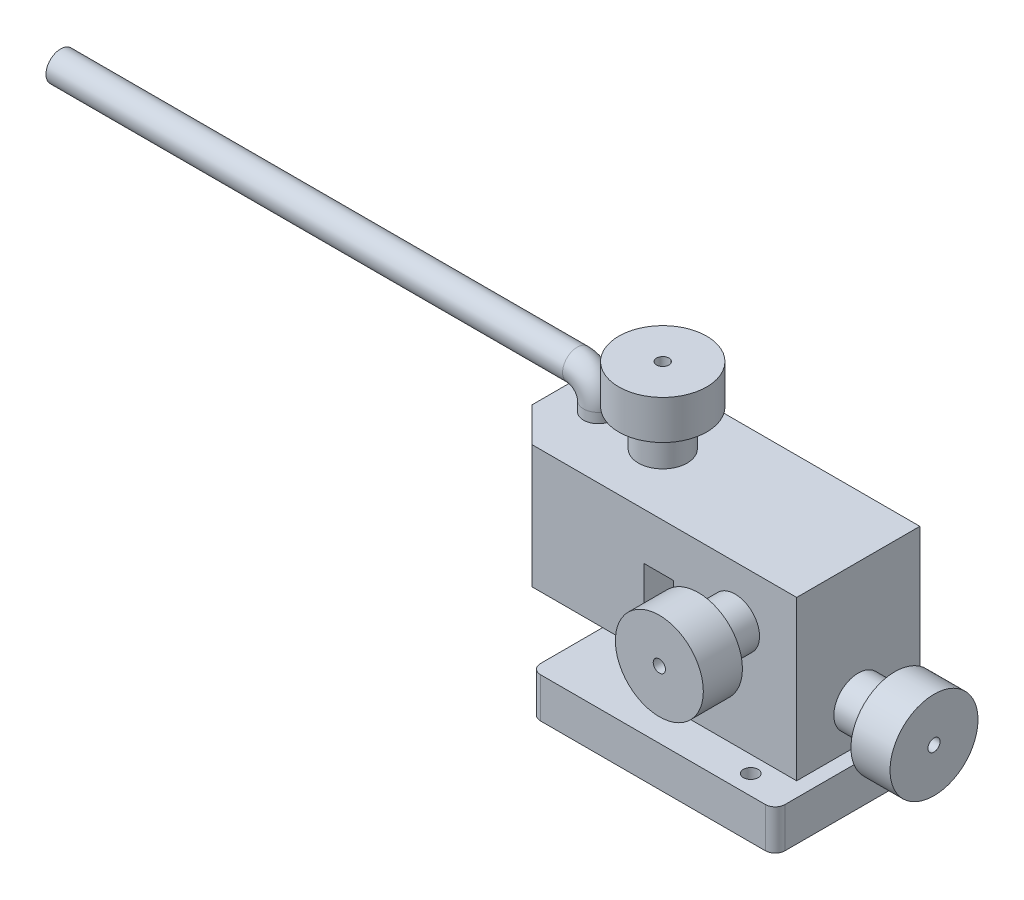
ISO-10303-21;
HEADER;
FILE_DESCRIPTION(('STEP AP214'),'2;1');
FILE_NAME('part.step','',(''),(''),'','','');
FILE_SCHEMA(('AUTOMOTIVE_DESIGN { 1 0 10303 214 1 1 1 1 }'));
ENDSEC;
DATA;
#1=APPLICATION_CONTEXT('core data for automotive mechanical design processes');
#2=APPLICATION_PROTOCOL_DEFINITION('international standard','automotive_design',2000,#1);
#3=PRODUCT_CONTEXT('',#1,'mechanical');
#4=PRODUCT('Part','Part','',(#3));
#5=PRODUCT_RELATED_PRODUCT_CATEGORY('part','',(#4));
#6=PRODUCT_DEFINITION_FORMATION('','',#4);
#7=PRODUCT_DEFINITION_CONTEXT('part definition',#1,'design');
#8=PRODUCT_DEFINITION('design','',#6,#7);
#9=PRODUCT_DEFINITION_SHAPE('','',#8);
#10=(LENGTH_UNIT() NAMED_UNIT(*) SI_UNIT(.MILLI.,.METRE.));
#11=(NAMED_UNIT(*) PLANE_ANGLE_UNIT() SI_UNIT($,.RADIAN.));
#12=(NAMED_UNIT(*) SI_UNIT($,.STERADIAN.) SOLID_ANGLE_UNIT());
#13=UNCERTAINTY_MEASURE_WITH_UNIT(LENGTH_MEASURE(1.E-05),#10,'distance_accuracy_value','');
#14=(GEOMETRIC_REPRESENTATION_CONTEXT(3) GLOBAL_UNCERTAINTY_ASSIGNED_CONTEXT((#13)) GLOBAL_UNIT_ASSIGNED_CONTEXT((#10,
#11,#12)) REPRESENTATION_CONTEXT('',''));
#15=CARTESIAN_POINT('',(0.,0.,0.));
#16=DIRECTION('',(0.,0.,1.));
#17=DIRECTION('',(1.,0.,0.));
#18=AXIS2_PLACEMENT_3D('',#15,#16,#17);
#19=CARTESIAN_POINT('',(21.8,40.7,-32.6));
#20=DIRECTION('',(1.,0.,0.));
#21=DIRECTION('',(0.,0.,-1.));
#22=AXIS2_PLACEMENT_3D('',#19,#20,#21);
#23=PLANE('',#22);
#24=DIRECTION('',(0.,0.,1.));
#25=VECTOR('',#24,1.);
#26=CARTESIAN_POINT('',(21.8,31.1,-32.6));
#27=LINE('',#26,#25);
#28=CARTESIAN_POINT('',(21.8,31.1,-32.6));
#29=VERTEX_POINT('',#28);
#30=CARTESIAN_POINT('',(21.8,31.1,-7.4));
#31=VERTEX_POINT('',#30);
#32=EDGE_CURVE('E189',#29,#31,#27,.T.);
#33=ORIENTED_EDGE('',*,*,#32,.F.);
#34=DIRECTION('',(0.,-1.,0.));
#35=VECTOR('',#34,1.);
#36=CARTESIAN_POINT('',(21.8,40.7,-32.6));
#37=LINE('',#36,#35);
#38=CARTESIAN_POINT('',(21.8,8.2,-32.6));
#39=VERTEX_POINT('',#38);
#40=EDGE_CURVE('E238',#29,#39,#37,.T.);
#41=ORIENTED_EDGE('',*,*,#40,.T.);
#42=DIRECTION('',(0.,0.,1.));
#43=VECTOR('',#42,1.);
#44=CARTESIAN_POINT('',(21.8,8.2,-32.6));
#45=LINE('',#44,#43);
#46=CARTESIAN_POINT('',(21.8,8.2,-7.4));
#47=VERTEX_POINT('',#46);
#48=EDGE_CURVE('E227',#39,#47,#45,.T.);
#49=ORIENTED_EDGE('',*,*,#48,.T.);
#50=DIRECTION('',(0.,-1.,0.));
#51=VECTOR('',#50,1.);
#52=CARTESIAN_POINT('',(21.8,40.7,-7.4));
#53=LINE('',#52,#51);
#54=EDGE_CURVE('E262',#31,#47,#53,.T.);
#55=ORIENTED_EDGE('',*,*,#54,.F.);
#56=EDGE_LOOP('',(#33,#41,#49,#55));
#57=FACE_BOUND('',#56,.T.);
#58=ADVANCED_FACE('F53',(#57),#23,.F.);
#59=CARTESIAN_POINT('',(2.,8.2,-2.));
#60=DIRECTION('',(0.,-1.,0.));
#61=DIRECTION('',(0.,0.,-1.));
#62=AXIS2_PLACEMENT_3D('',#59,#60,#61);
#63=PLANE('',#62);
#64=CARTESIAN_POINT('',(41.,8.2,-4.));
#65=DIRECTION('',(0.,-1.,0.));
#66=DIRECTION('',(0.,0.,-1.));
#67=AXIS2_PLACEMENT_3D('',#64,#65,#66);
#68=CIRCLE('',#67,1.5);
#69=CARTESIAN_POINT('',(41.,8.2,-5.5));
#70=VERTEX_POINT('',#69);
#71=EDGE_CURVE('E469',#70,#70,#68,.F.);
#72=ORIENTED_EDGE('',*,*,#71,.F.);
#73=EDGE_LOOP('',(#72));
#74=FACE_BOUND('',#73,.T.);
#75=CARTESIAN_POINT('',(41.,8.2,-36.));
#76=DIRECTION('',(0.,-1.,0.));
#77=DIRECTION('',(0.,0.,-1.));
#78=AXIS2_PLACEMENT_3D('',#75,#76,#77);
#79=CIRCLE('',#78,1.5);
#80=CARTESIAN_POINT('',(41.,8.2,-37.5));
#81=VERTEX_POINT('',#80);
#82=EDGE_CURVE('E475',#81,#81,#79,.F.);
#83=ORIENTED_EDGE('',*,*,#82,.F.);
#84=EDGE_LOOP('',(#83));
#85=FACE_BOUND('',#84,.T.);
#86=CARTESIAN_POINT('',(2.,8.2,-2.));
#87=DIRECTION('',(0.,1.,0.));
#88=DIRECTION('',(0.,0.,-1.));
#89=AXIS2_PLACEMENT_3D('',#86,#87,#88);
#90=CIRCLE('',#89,2.);
#91=CARTESIAN_POINT('',(0.,8.2,-2.00000000000001));
#92=VERTEX_POINT('',#91);
#93=CARTESIAN_POINT('',(2.00000000000001,8.2,0.));
#94=VERTEX_POINT('',#93);
#95=EDGE_CURVE('E266',#92,#94,#90,.T.);
#96=ORIENTED_EDGE('',*,*,#95,.T.);
#97=DIRECTION('',(1.,0.,0.));
#98=VECTOR('',#97,1.);
#99=CARTESIAN_POINT('',(2.00000000000001,8.2,0.));
#100=LINE('',#99,#98);
#101=CARTESIAN_POINT('',(48.,8.2,0.));
#102=VERTEX_POINT('',#101);
#103=EDGE_CURVE('E270',#94,#102,#100,.T.);
#104=ORIENTED_EDGE('',*,*,#103,.T.);
#105=CARTESIAN_POINT('',(48.,8.2,-2.));
#106=DIRECTION('',(0.,1.,0.));
#107=DIRECTION('',(0.,0.,1.));
#108=AXIS2_PLACEMENT_3D('',#105,#106,#107);
#109=CIRCLE('',#108,2.);
#110=CARTESIAN_POINT('',(50.,8.2,-2.00000000000001));
#111=VERTEX_POINT('',#110);
#112=EDGE_CURVE('E274',#102,#111,#109,.T.);
#113=ORIENTED_EDGE('',*,*,#112,.T.);
#114=DIRECTION('',(0.,0.,-1.));
#115=VECTOR('',#114,1.);
#116=CARTESIAN_POINT('',(50.,8.2,-2.00000000000001));
#117=LINE('',#116,#115);
#118=CARTESIAN_POINT('',(50.,8.2,-38.));
#119=VERTEX_POINT('',#118);
#120=EDGE_CURVE('E277',#111,#119,#117,.T.);
#121=ORIENTED_EDGE('',*,*,#120,.T.);
#122=CARTESIAN_POINT('',(48.,8.2,-38.));
#123=DIRECTION('',(0.,1.,0.));
#124=DIRECTION('',(0.,0.,-1.));
#125=AXIS2_PLACEMENT_3D('',#122,#123,#124);
#126=CIRCLE('',#125,2.);
#127=CARTESIAN_POINT('',(48.,8.2,-40.));
#128=VERTEX_POINT('',#127);
#129=EDGE_CURVE('E280',#119,#128,#126,.T.);
#130=ORIENTED_EDGE('',*,*,#129,.T.);
#131=DIRECTION('',(-1.,0.,0.));
#132=VECTOR('',#131,1.);
#133=CARTESIAN_POINT('',(2.00000000000001,8.2,-40.));
#134=LINE('',#133,#132);
#135=CARTESIAN_POINT('',(2.00000000000001,8.2,-40.));
#136=VERTEX_POINT('',#135);
#137=EDGE_CURVE('E283',#128,#136,#134,.T.);
#138=ORIENTED_EDGE('',*,*,#137,.T.);
#139=CARTESIAN_POINT('',(2.,8.2,-38.));
#140=DIRECTION('',(0.,1.,0.));
#141=DIRECTION('',(0.,0.,-1.));
#142=AXIS2_PLACEMENT_3D('',#139,#140,#141);
#143=CIRCLE('',#142,2.);
#144=CARTESIAN_POINT('',(0.,8.2,-38.));
#145=VERTEX_POINT('',#144);
#146=EDGE_CURVE('E286',#136,#145,#143,.T.);
#147=ORIENTED_EDGE('',*,*,#146,.T.);
#148=DIRECTION('',(0.,0.,1.));
#149=VECTOR('',#148,1.);
#150=CARTESIAN_POINT('',(0.,8.2,-2.00000000000001));
#151=LINE('',#150,#149);
#152=EDGE_CURVE('E289',#145,#92,#151,.T.);
#153=ORIENTED_EDGE('',*,*,#152,.T.);
#154=EDGE_LOOP('',(#96,#104,#113,#121,#130,#138,#147,#153));
#155=FACE_BOUND('',#154,.T.);
#156=ORIENTED_EDGE('',*,*,#48,.F.);
#157=DIRECTION('',(-1.,0.,0.));
#158=VECTOR('',#157,1.);
#159=CARTESIAN_POINT('',(21.8,8.2,-32.6));
#160=LINE('',#159,#158);
#161=CARTESIAN_POINT('',(47.,8.2,-32.6));
#162=VERTEX_POINT('',#161);
#163=EDGE_CURVE('E232',#162,#39,#160,.T.);
#164=ORIENTED_EDGE('',*,*,#163,.F.);
#165=DIRECTION('',(0.,0.,-1.));
#166=VECTOR('',#165,1.);
#167=CARTESIAN_POINT('',(47.,8.2,-32.6));
#168=LINE('',#167,#166);
#169=CARTESIAN_POINT('',(47.,8.2,-7.4));
#170=VERTEX_POINT('',#169);
#171=EDGE_CURVE('E246',#170,#162,#168,.T.);
#172=ORIENTED_EDGE('',*,*,#171,.F.);
#173=DIRECTION('',(1.,0.,0.));
#174=VECTOR('',#173,1.);
#175=CARTESIAN_POINT('',(21.8,8.2,-7.4));
#176=LINE('',#175,#174);
#177=EDGE_CURVE('E242',#47,#170,#176,.T.);
#178=ORIENTED_EDGE('',*,*,#177,.F.);
#179=EDGE_LOOP('',(#156,#164,#172,#178));
#180=FACE_BOUND('',#179,.T.);
#181=ADVANCED_FACE('F389',(#74,#85,#155,#180),#63,.F.);
#182=CARTESIAN_POINT('',(2.,8.2,-2.));
#183=DIRECTION('',(0.,-1.,0.));
#184=DIRECTION('',(0.,0.,-1.));
#185=AXIS2_PLACEMENT_3D('',#182,#183,#184);
#186=CYLINDRICAL_SURFACE('',#185,2.);
#187=CARTESIAN_POINT('',(2.,0.,-2.));
#188=DIRECTION('',(0.,1.,0.));
#189=DIRECTION('',(0.,0.,-1.));
#190=AXIS2_PLACEMENT_3D('',#187,#188,#189);
#191=CIRCLE('',#190,2.);
#192=CARTESIAN_POINT('',(0.,0.,-2.00000000000001));
#193=VERTEX_POINT('',#192);
#194=CARTESIAN_POINT('',(2.00000000000001,0.,0.));
#195=VERTEX_POINT('',#194);
#196=EDGE_CURVE('E265',#193,#195,#191,.T.);
#197=ORIENTED_EDGE('',*,*,#196,.T.);
#198=DIRECTION('',(0.,-1.,0.));
#199=VECTOR('',#198,1.);
#200=CARTESIAN_POINT('',(2.00000000000001,8.2,0.));
#201=LINE('',#200,#199);
#202=EDGE_CURVE('E343',#94,#195,#201,.T.);
#203=ORIENTED_EDGE('',*,*,#202,.F.);
#204=ORIENTED_EDGE('',*,*,#95,.F.);
#205=DIRECTION('',(0.,-1.,0.));
#206=VECTOR('',#205,1.);
#207=CARTESIAN_POINT('',(0.,8.2,-2.00000000000001));
#208=LINE('',#207,#206);
#209=EDGE_CURVE('E292',#92,#193,#208,.T.);
#210=ORIENTED_EDGE('',*,*,#209,.T.);
#211=EDGE_LOOP('',(#197,#203,#204,#210));
#212=FACE_BOUND('',#211,.T.);
#213=ADVANCED_FACE('F539',(#212),#186,.T.);
#214=CARTESIAN_POINT('',(2.00000000000001,8.2,0.));
#215=DIRECTION('',(0.,0.,-1.));
#216=DIRECTION('',(-1.,0.,0.));
#217=AXIS2_PLACEMENT_3D('',#214,#215,#216);
#218=PLANE('',#217);
#219=DIRECTION('',(1.,0.,0.));
#220=VECTOR('',#219,1.);
#221=CARTESIAN_POINT('',(2.00000000000001,0.,0.));
#222=LINE('',#221,#220);
#223=CARTESIAN_POINT('',(48.,0.,0.));
#224=VERTEX_POINT('',#223);
#225=EDGE_CURVE('E296',#195,#224,#222,.T.);
#226=ORIENTED_EDGE('',*,*,#225,.T.);
#227=DIRECTION('',(0.,-1.,0.));
#228=VECTOR('',#227,1.);
#229=CARTESIAN_POINT('',(48.,8.2,0.));
#230=LINE('',#229,#228);
#231=EDGE_CURVE('E339',#102,#224,#230,.T.);
#232=ORIENTED_EDGE('',*,*,#231,.F.);
#233=ORIENTED_EDGE('',*,*,#103,.F.);
#234=ORIENTED_EDGE('',*,*,#202,.T.);
#235=EDGE_LOOP('',(#226,#232,#233,#234));
#236=FACE_BOUND('',#235,.T.);
#237=ADVANCED_FACE('F571',(#236),#218,.F.);
#238=CARTESIAN_POINT('',(48.,8.2,-2.));
#239=DIRECTION('',(0.,-1.,0.));
#240=DIRECTION('',(0.,0.,-1.));
#241=AXIS2_PLACEMENT_3D('',#238,#239,#240);
#242=CYLINDRICAL_SURFACE('',#241,2.);
#243=CARTESIAN_POINT('',(48.,0.,-2.));
#244=DIRECTION('',(0.,1.,0.));
#245=DIRECTION('',(0.,0.,1.));
#246=AXIS2_PLACEMENT_3D('',#243,#244,#245);
#247=CIRCLE('',#246,2.);
#248=CARTESIAN_POINT('',(50.,0.,-2.00000000000001));
#249=VERTEX_POINT('',#248);
#250=EDGE_CURVE('E299',#224,#249,#247,.T.);
#251=ORIENTED_EDGE('',*,*,#250,.T.);
#252=DIRECTION('',(0.,-1.,0.));
#253=VECTOR('',#252,1.);
#254=CARTESIAN_POINT('',(50.,8.2,-2.00000000000001));
#255=LINE('',#254,#253);
#256=EDGE_CURVE('E335',#111,#249,#255,.T.);
#257=ORIENTED_EDGE('',*,*,#256,.F.);
#258=ORIENTED_EDGE('',*,*,#112,.F.);
#259=ORIENTED_EDGE('',*,*,#231,.T.);
#260=EDGE_LOOP('',(#251,#257,#258,#259));
#261=FACE_BOUND('',#260,.T.);
#262=ADVANCED_FACE('F567',(#261),#242,.T.);
#263=CARTESIAN_POINT('',(50.,8.2,-2.00000000000001));
#264=DIRECTION('',(-1.,0.,0.));
#265=DIRECTION('',(0.,0.,1.));
#266=AXIS2_PLACEMENT_3D('',#263,#264,#265);
#267=PLANE('',#266);
#268=DIRECTION('',(0.,0.,-1.));
#269=VECTOR('',#268,1.);
#270=CARTESIAN_POINT('',(50.,0.,-2.00000000000001));
#271=LINE('',#270,#269);
#272=CARTESIAN_POINT('',(50.,0.,-38.));
#273=VERTEX_POINT('',#272);
#274=EDGE_CURVE('E302',#249,#273,#271,.T.);
#275=ORIENTED_EDGE('',*,*,#274,.T.);
#276=DIRECTION('',(0.,-1.,0.));
#277=VECTOR('',#276,1.);
#278=CARTESIAN_POINT('',(50.,8.2,-38.));
#279=LINE('',#278,#277);
#280=EDGE_CURVE('E331',#119,#273,#279,.T.);
#281=ORIENTED_EDGE('',*,*,#280,.F.);
#282=ORIENTED_EDGE('',*,*,#120,.F.);
#283=ORIENTED_EDGE('',*,*,#256,.T.);
#284=EDGE_LOOP('',(#275,#281,#282,#283));
#285=FACE_BOUND('',#284,.T.);
#286=ADVANCED_FACE('F563',(#285),#267,.F.);
#287=CARTESIAN_POINT('',(48.,8.2,-38.));
#288=DIRECTION('',(0.,-1.,0.));
#289=DIRECTION('',(0.,0.,-1.));
#290=AXIS2_PLACEMENT_3D('',#287,#288,#289);
#291=CYLINDRICAL_SURFACE('',#290,2.);
#292=CARTESIAN_POINT('',(48.,0.,-38.));
#293=DIRECTION('',(0.,1.,0.));
#294=DIRECTION('',(0.,0.,-1.));
#295=AXIS2_PLACEMENT_3D('',#292,#293,#294);
#296=CIRCLE('',#295,2.);
#297=CARTESIAN_POINT('',(48.,0.,-40.));
#298=VERTEX_POINT('',#297);
#299=EDGE_CURVE('E305',#273,#298,#296,.T.);
#300=ORIENTED_EDGE('',*,*,#299,.T.);
#301=DIRECTION('',(0.,-1.,0.));
#302=VECTOR('',#301,1.);
#303=CARTESIAN_POINT('',(48.,8.2,-40.));
#304=LINE('',#303,#302);
#305=EDGE_CURVE('E327',#128,#298,#304,.T.);
#306=ORIENTED_EDGE('',*,*,#305,.F.);
#307=ORIENTED_EDGE('',*,*,#129,.F.);
#308=ORIENTED_EDGE('',*,*,#280,.T.);
#309=EDGE_LOOP('',(#300,#306,#307,#308));
#310=FACE_BOUND('',#309,.T.);
#311=ADVANCED_FACE('F559',(#310),#291,.T.);
#312=CARTESIAN_POINT('',(2.00000000000001,8.2,-40.));
#313=DIRECTION('',(0.,0.,1.));
#314=DIRECTION('',(1.,0.,0.));
#315=AXIS2_PLACEMENT_3D('',#312,#313,#314);
#316=PLANE('',#315);
#317=DIRECTION('',(-1.,0.,0.));
#318=VECTOR('',#317,1.);
#319=CARTESIAN_POINT('',(2.00000000000001,0.,-40.));
#320=LINE('',#319,#318);
#321=CARTESIAN_POINT('',(2.00000000000001,0.,-40.));
#322=VERTEX_POINT('',#321);
#323=EDGE_CURVE('E308',#298,#322,#320,.T.);
#324=ORIENTED_EDGE('',*,*,#323,.T.);
#325=DIRECTION('',(0.,-1.,0.));
#326=VECTOR('',#325,1.);
#327=CARTESIAN_POINT('',(2.00000000000001,8.2,-40.));
#328=LINE('',#327,#326);
#329=EDGE_CURVE('E323',#136,#322,#328,.T.);
#330=ORIENTED_EDGE('',*,*,#329,.F.);
#331=ORIENTED_EDGE('',*,*,#137,.F.);
#332=ORIENTED_EDGE('',*,*,#305,.T.);
#333=EDGE_LOOP('',(#324,#330,#331,#332));
#334=FACE_BOUND('',#333,.T.);
#335=ADVANCED_FACE('F555',(#334),#316,.F.);
#336=CARTESIAN_POINT('',(2.,8.2,-38.));
#337=DIRECTION('',(0.,-1.,0.));
#338=DIRECTION('',(0.,0.,-1.));
#339=AXIS2_PLACEMENT_3D('',#336,#337,#338);
#340=CYLINDRICAL_SURFACE('',#339,2.);
#341=CARTESIAN_POINT('',(2.,0.,-38.));
#342=DIRECTION('',(0.,1.,0.));
#343=DIRECTION('',(0.,0.,-1.));
#344=AXIS2_PLACEMENT_3D('',#341,#342,#343);
#345=CIRCLE('',#344,2.);
#346=CARTESIAN_POINT('',(0.,0.,-38.));
#347=VERTEX_POINT('',#346);
#348=EDGE_CURVE('E311',#322,#347,#345,.T.);
#349=ORIENTED_EDGE('',*,*,#348,.T.);
#350=DIRECTION('',(0.,-1.,0.));
#351=VECTOR('',#350,1.);
#352=CARTESIAN_POINT('',(0.,8.2,-38.));
#353=LINE('',#352,#351);
#354=EDGE_CURVE('E319',#145,#347,#353,.T.);
#355=ORIENTED_EDGE('',*,*,#354,.F.);
#356=ORIENTED_EDGE('',*,*,#146,.F.);
#357=ORIENTED_EDGE('',*,*,#329,.T.);
#358=EDGE_LOOP('',(#349,#355,#356,#357));
#359=FACE_BOUND('',#358,.T.);
#360=ADVANCED_FACE('F551',(#359),#340,.T.);
#361=CARTESIAN_POINT('',(0.,8.2,-2.00000000000001));
#362=DIRECTION('',(1.,0.,0.));
#363=DIRECTION('',(0.,0.,-1.));
#364=AXIS2_PLACEMENT_3D('',#361,#362,#363);
#365=PLANE('',#364);
#366=DIRECTION('',(0.,0.,1.));
#367=VECTOR('',#366,1.);
#368=CARTESIAN_POINT('',(0.,0.,-2.00000000000001));
#369=LINE('',#368,#367);
#370=EDGE_CURVE('E271',#347,#193,#369,.T.);
#371=ORIENTED_EDGE('',*,*,#370,.T.);
#372=ORIENTED_EDGE('',*,*,#209,.F.);
#373=ORIENTED_EDGE('',*,*,#152,.F.);
#374=ORIENTED_EDGE('',*,*,#354,.T.);
#375=EDGE_LOOP('',(#371,#372,#373,#374));
#376=FACE_BOUND('',#375,.T.);
#377=ADVANCED_FACE('F547',(#376),#365,.F.);
#378=CARTESIAN_POINT('',(2.,0.,-2.));
#379=DIRECTION('',(0.,-1.,0.));
#380=DIRECTION('',(0.,0.,-1.));
#381=AXIS2_PLACEMENT_3D('',#378,#379,#380);
#382=PLANE('',#381);
#383=CARTESIAN_POINT('',(41.,0.,-4.));
#384=DIRECTION('',(0.,-1.,0.));
#385=DIRECTION('',(0.,0.,-1.));
#386=AXIS2_PLACEMENT_3D('',#383,#384,#385);
#387=CIRCLE('',#386,1.5);
#388=CARTESIAN_POINT('',(41.,0.,-5.5));
#389=VERTEX_POINT('',#388);
#390=EDGE_CURVE('E474',#389,#389,#387,.T.);
#391=ORIENTED_EDGE('',*,*,#390,.F.);
#392=EDGE_LOOP('',(#391));
#393=FACE_BOUND('',#392,.T.);
#394=CARTESIAN_POINT('',(41.,0.,-36.));
#395=DIRECTION('',(0.,-1.,0.));
#396=DIRECTION('',(0.,0.,-1.));
#397=AXIS2_PLACEMENT_3D('',#394,#395,#396);
#398=CIRCLE('',#397,1.5);
#399=CARTESIAN_POINT('',(41.,0.,-37.5));
#400=VERTEX_POINT('',#399);
#401=EDGE_CURVE('E470',#400,#400,#398,.T.);
#402=ORIENTED_EDGE('',*,*,#401,.F.);
#403=EDGE_LOOP('',(#402));
#404=FACE_BOUND('',#403,.T.);
#405=ORIENTED_EDGE('',*,*,#196,.F.);
#406=ORIENTED_EDGE('',*,*,#370,.F.);
#407=ORIENTED_EDGE('',*,*,#348,.F.);
#408=ORIENTED_EDGE('',*,*,#323,.F.);
#409=ORIENTED_EDGE('',*,*,#299,.F.);
#410=ORIENTED_EDGE('',*,*,#274,.F.);
#411=ORIENTED_EDGE('',*,*,#250,.F.);
#412=ORIENTED_EDGE('',*,*,#225,.F.);
#413=EDGE_LOOP('',(#405,#406,#407,#408,#409,#410,#411,#412));
#414=FACE_BOUND('',#413,.T.);
#415=ADVANCED_FACE('F544',(#393,#404,#414),#382,.T.);
#416=CARTESIAN_POINT('',(21.8,40.7,-7.4));
#417=DIRECTION('',(0.,0.,-1.));
#418=DIRECTION('',(-1.,0.,0.));
#419=AXIS2_PLACEMENT_3D('',#416,#417,#418);
#420=PLANE('',#419);
#421=CARTESIAN_POINT('',(34.4,30.,-7.4));
#422=DIRECTION('',(0.,0.,-1.));
#423=DIRECTION('',(-1.,0.,0.));
#424=AXIS2_PLACEMENT_3D('',#421,#422,#423);
#425=CIRCLE('',#424,5.);
#426=CARTESIAN_POINT('',(29.4,30.,-7.4));
#427=VERTEX_POINT('',#426);
#428=EDGE_CURVE('E11',#427,#427,#425,.F.);
#429=ORIENTED_EDGE('',*,*,#428,.F.);
#430=EDGE_LOOP('',(#429));
#431=FACE_BOUND('',#430,.T.);
#432=DIRECTION('',(1.,0.,0.));
#433=VECTOR('',#432,1.);
#434=CARTESIAN_POINT('',(21.8,40.7,-7.4));
#435=LINE('',#434,#433);
#436=CARTESIAN_POINT('',(-7.19999999999998,40.7,-7.4));
#437=VERTEX_POINT('',#436);
#438=CARTESIAN_POINT('',(47.,40.7,-7.4));
#439=VERTEX_POINT('',#438);
#440=EDGE_CURVE('E228',#437,#439,#435,.T.);
#441=ORIENTED_EDGE('',*,*,#440,.F.);
#442=DIRECTION('',(0.,-1.,0.));
#443=VECTOR('',#442,1.);
#444=CARTESIAN_POINT('',(-7.19999999999998,15.5,-7.4));
#445=LINE('',#444,#443);
#446=CARTESIAN_POINT('',(-7.19999999999998,15.5,-7.4));
#447=VERTEX_POINT('',#446);
#448=EDGE_CURVE('E78',#437,#447,#445,.T.);
#449=ORIENTED_EDGE('',*,*,#448,.T.);
#450=DIRECTION('',(1.,0.,0.));
#451=VECTOR('',#450,1.);
#452=CARTESIAN_POINT('',(-14.2,15.5,-7.4));
#453=LINE('',#452,#451);
#454=CARTESIAN_POINT('',(15.8,15.5,-7.4));
#455=VERTEX_POINT('',#454);
#456=EDGE_CURVE('E190',#447,#455,#453,.T.);
#457=ORIENTED_EDGE('',*,*,#456,.T.);
#458=DIRECTION('',(0.,1.,0.));
#459=VECTOR('',#458,1.);
#460=CARTESIAN_POINT('',(15.8,40.7,-7.4));
#461=LINE('',#460,#459);
#462=CARTESIAN_POINT('',(15.8,31.1,-7.4));
#463=VERTEX_POINT('',#462);
#464=EDGE_CURVE('E205',#455,#463,#461,.T.);
#465=ORIENTED_EDGE('',*,*,#464,.T.);
#466=DIRECTION('',(1.,0.,0.));
#467=VECTOR('',#466,1.);
#468=CARTESIAN_POINT('',(15.8,31.1,-7.4));
#469=LINE('',#468,#467);
#470=EDGE_CURVE('E219',#463,#31,#469,.T.);
#471=ORIENTED_EDGE('',*,*,#470,.T.);
#472=ORIENTED_EDGE('',*,*,#54,.T.);
#473=ORIENTED_EDGE('',*,*,#177,.T.);
#474=DIRECTION('',(0.,-1.,0.));
#475=VECTOR('',#474,1.);
#476=CARTESIAN_POINT('',(47.,40.7,-7.4));
#477=LINE('',#476,#475);
#478=EDGE_CURVE('E258',#439,#170,#477,.T.);
#479=ORIENTED_EDGE('',*,*,#478,.F.);
#480=EDGE_LOOP('',(#441,#449,#457,#465,#471,#472,#473,#479));
#481=FACE_BOUND('',#480,.T.);
#482=ADVANCED_FACE('F379',(#431,#481),#420,.F.);
#483=CARTESIAN_POINT('',(47.,40.7,-32.6));
#484=DIRECTION('',(-1.,0.,0.));
#485=DIRECTION('',(0.,0.,1.));
#486=AXIS2_PLACEMENT_3D('',#483,#484,#485);
#487=PLANE('',#486);
#488=CARTESIAN_POINT('',(47.,16.,-20.));
#489=DIRECTION('',(-1.,0.,0.));
#490=DIRECTION('',(0.,0.,1.));
#491=AXIS2_PLACEMENT_3D('',#488,#489,#490);
#492=CIRCLE('',#491,5.);
#493=CARTESIAN_POINT('',(47.,16.,-15.));
#494=VERTEX_POINT('',#493);
#495=EDGE_CURVE('E63',#494,#494,#492,.F.);
#496=ORIENTED_EDGE('',*,*,#495,.F.);
#497=EDGE_LOOP('',(#496));
#498=FACE_BOUND('',#497,.T.);
#499=ORIENTED_EDGE('',*,*,#171,.T.);
#500=DIRECTION('',(0.,-1.,0.));
#501=VECTOR('',#500,1.);
#502=CARTESIAN_POINT('',(47.,40.7,-32.6));
#503=LINE('',#502,#501);
#504=CARTESIAN_POINT('',(47.,40.7,-32.6));
#505=VERTEX_POINT('',#504);
#506=EDGE_CURVE('E255',#505,#162,#503,.T.);
#507=ORIENTED_EDGE('',*,*,#506,.F.);
#508=DIRECTION('',(0.,0.,-1.));
#509=VECTOR('',#508,1.);
#510=CARTESIAN_POINT('',(47.,40.7,-32.6));
#511=LINE('',#510,#509);
#512=EDGE_CURVE('E231',#439,#505,#511,.T.);
#513=ORIENTED_EDGE('',*,*,#512,.F.);
#514=ORIENTED_EDGE('',*,*,#478,.T.);
#515=EDGE_LOOP('',(#499,#507,#513,#514));
#516=FACE_BOUND('',#515,.T.);
#517=ADVANCED_FACE('F376',(#498,#516),#487,.F.);
#518=CARTESIAN_POINT('',(21.8,40.7,-32.6));
#519=DIRECTION('',(0.,0.,1.));
#520=DIRECTION('',(1.,0.,0.));
#521=AXIS2_PLACEMENT_3D('',#518,#519,#520);
#522=PLANE('',#521);
#523=ORIENTED_EDGE('',*,*,#506,.T.);
#524=ORIENTED_EDGE('',*,*,#163,.T.);
#525=ORIENTED_EDGE('',*,*,#40,.F.);
#526=DIRECTION('',(1.,0.,0.));
#527=VECTOR('',#526,1.);
#528=CARTESIAN_POINT('',(15.8,31.1,-32.6));
#529=LINE('',#528,#527);
#530=CARTESIAN_POINT('',(15.8,31.1,-32.6));
#531=VERTEX_POINT('',#530);
#532=EDGE_CURVE('E197',#531,#29,#529,.T.);
#533=ORIENTED_EDGE('',*,*,#532,.F.);
#534=DIRECTION('',(0.,-1.,0.));
#535=VECTOR('',#534,1.);
#536=CARTESIAN_POINT('',(15.8,40.7,-32.6));
#537=LINE('',#536,#535);
#538=CARTESIAN_POINT('',(15.8,15.5,-32.6));
#539=VERTEX_POINT('',#538);
#540=EDGE_CURVE('E194',#531,#539,#537,.T.);
#541=ORIENTED_EDGE('',*,*,#540,.T.);
#542=DIRECTION('',(1.,0.,0.));
#543=VECTOR('',#542,1.);
#544=CARTESIAN_POINT('',(-14.2,15.5,-32.6));
#545=LINE('',#544,#543);
#546=CARTESIAN_POINT('',(-7.19999999999998,15.5,-32.6));
#547=VERTEX_POINT('',#546);
#548=EDGE_CURVE('E179',#547,#539,#545,.T.);
#549=ORIENTED_EDGE('',*,*,#548,.F.);
#550=DIRECTION('',(0.,1.,0.));
#551=VECTOR('',#550,1.);
#552=CARTESIAN_POINT('',(-7.19999999999998,40.7,-32.6));
#553=LINE('',#552,#551);
#554=CARTESIAN_POINT('',(-7.19999999999998,40.7,-32.6));
#555=VERTEX_POINT('',#554);
#556=EDGE_CURVE('E368',#547,#555,#553,.T.);
#557=ORIENTED_EDGE('',*,*,#556,.T.);
#558=DIRECTION('',(-1.,0.,0.));
#559=VECTOR('',#558,1.);
#560=CARTESIAN_POINT('',(21.8,40.7,-32.6));
#561=LINE('',#560,#559);
#562=EDGE_CURVE('E235',#505,#555,#561,.T.);
#563=ORIENTED_EDGE('',*,*,#562,.F.);
#564=EDGE_LOOP('',(#523,#524,#525,#533,#541,#549,#557,#563));
#565=FACE_BOUND('',#564,.T.);
#566=ADVANCED_FACE('F195',(#565),#522,.F.);
#567=CARTESIAN_POINT('',(0.,40.7,0.));
#568=DIRECTION('',(0.,1.,0.));
#569=DIRECTION('',(0.,0.,1.));
#570=AXIS2_PLACEMENT_3D('',#567,#568,#569);
#571=PLANE('',#570);
#572=CARTESIAN_POINT('',(-6.2,40.7,-20.));
#573=DIRECTION('',(0.,-1.,0.));
#574=DIRECTION('',(0.,0.,-1.));
#575=AXIS2_PLACEMENT_3D('',#572,#573,#574);
#576=CIRCLE('',#575,3.);
#577=CARTESIAN_POINT('',(-6.2,40.7,-23.));
#578=VERTEX_POINT('',#577);
#579=EDGE_CURVE('E465',#578,#578,#576,.T.);
#580=ORIENTED_EDGE('',*,*,#579,.T.);
#581=EDGE_LOOP('',(#580));
#582=FACE_BOUND('',#581,.T.);
#583=CARTESIAN_POINT('',(6.99999999999999,40.7,-20.));
#584=DIRECTION('',(0.,1.,0.));
#585=DIRECTION('',(0.,0.,1.));
#586=AXIS2_PLACEMENT_3D('',#583,#584,#585);
#587=CIRCLE('',#586,5.);
#588=CARTESIAN_POINT('',(6.99999999999999,40.7,-15.));
#589=VERTEX_POINT('',#588);
#590=EDGE_CURVE('E430',#589,#589,#587,.T.);
#591=ORIENTED_EDGE('',*,*,#590,.F.);
#592=EDGE_LOOP('',(#591));
#593=FACE_BOUND('',#592,.T.);
#594=DIRECTION('',(0.,0.,-1.));
#595=VECTOR('',#594,1.);
#596=CARTESIAN_POINT('',(-14.2,40.7,-32.6));
#597=LINE('',#596,#595);
#598=CARTESIAN_POINT('',(-14.2,40.7,-14.4));
#599=VERTEX_POINT('',#598);
#600=CARTESIAN_POINT('',(-14.2,40.7,-25.6));
#601=VERTEX_POINT('',#600);
#602=EDGE_CURVE('E214',#599,#601,#597,.T.);
#603=ORIENTED_EDGE('',*,*,#602,.F.);
#604=DIRECTION('',(0.707106781186549,0.,0.707106781186546));
#605=VECTOR('',#604,1.);
#606=CARTESIAN_POINT('',(0.100000000000021,40.7,-0.100000000000021));
#607=LINE('',#606,#605);
#608=EDGE_CURVE('E358',#599,#437,#607,.T.);
#609=ORIENTED_EDGE('',*,*,#608,.T.);
#610=ORIENTED_EDGE('',*,*,#440,.T.);
#611=ORIENTED_EDGE('',*,*,#512,.T.);
#612=ORIENTED_EDGE('',*,*,#562,.T.);
#613=DIRECTION('',(-0.707106781186549,0.,0.707106781186546));
#614=VECTOR('',#613,1.);
#615=CARTESIAN_POINT('',(-19.9,40.7,-19.9));
#616=LINE('',#615,#614);
#617=EDGE_CURVE('E355',#555,#601,#616,.T.);
#618=ORIENTED_EDGE('',*,*,#617,.T.);
#619=EDGE_LOOP('',(#603,#609,#610,#611,#612,#618));
#620=FACE_BOUND('',#619,.T.);
#621=ADVANCED_FACE('F396',(#582,#593,#620),#571,.T.);
#622=CARTESIAN_POINT('',(15.8,31.1,-32.6));
#623=DIRECTION('',(0.,1.,0.));
#624=DIRECTION('',(0.,0.,1.));
#625=AXIS2_PLACEMENT_3D('',#622,#623,#624);
#626=PLANE('',#625);
#627=ORIENTED_EDGE('',*,*,#32,.T.);
#628=ORIENTED_EDGE('',*,*,#470,.F.);
#629=DIRECTION('',(0.,0.,1.));
#630=VECTOR('',#629,1.);
#631=CARTESIAN_POINT('',(15.8,31.1,-32.6));
#632=LINE('',#631,#630);
#633=EDGE_CURVE('E216',#531,#463,#632,.T.);
#634=ORIENTED_EDGE('',*,*,#633,.F.);
#635=ORIENTED_EDGE('',*,*,#532,.T.);
#636=EDGE_LOOP('',(#627,#628,#634,#635));
#637=FACE_BOUND('',#636,.T.);
#638=ADVANCED_FACE('F596',(#637),#626,.F.);
#639=CARTESIAN_POINT('',(15.8,0.,0.));
#640=DIRECTION('',(-1.,0.,0.));
#641=DIRECTION('',(0.,0.,1.));
#642=AXIS2_PLACEMENT_3D('',#639,#640,#641);
#643=PLANE('',#642);
#644=ORIENTED_EDGE('',*,*,#540,.F.);
#645=ORIENTED_EDGE('',*,*,#633,.T.);
#646=ORIENTED_EDGE('',*,*,#464,.F.);
#647=DIRECTION('',(0.,0.,1.));
#648=VECTOR('',#647,1.);
#649=CARTESIAN_POINT('',(15.8,15.5,-32.6));
#650=LINE('',#649,#648);
#651=EDGE_CURVE('E183',#539,#455,#650,.T.);
#652=ORIENTED_EDGE('',*,*,#651,.F.);
#653=EDGE_LOOP('',(#644,#645,#646,#652));
#654=FACE_BOUND('',#653,.T.);
#655=ADVANCED_FACE('F203',(#654),#643,.F.);
#656=CARTESIAN_POINT('',(-14.2,15.5,-32.6));
#657=DIRECTION('',(0.,1.,0.));
#658=DIRECTION('',(0.,0.,1.));
#659=AXIS2_PLACEMENT_3D('',#656,#657,#658);
#660=PLANE('',#659);
#661=ORIENTED_EDGE('',*,*,#456,.F.);
#662=DIRECTION('',(-0.707106781186549,0.,-0.707106781186546));
#663=VECTOR('',#662,1.);
#664=CARTESIAN_POINT('',(-14.2,15.5,-14.4));
#665=LINE('',#664,#663);
#666=CARTESIAN_POINT('',(-14.2,15.5,-14.4));
#667=VERTEX_POINT('',#666);
#668=EDGE_CURVE('E365',#447,#667,#665,.T.);
#669=ORIENTED_EDGE('',*,*,#668,.T.);
#670=DIRECTION('',(0.,0.,1.));
#671=VECTOR('',#670,1.);
#672=CARTESIAN_POINT('',(-14.2,15.5,-32.6));
#673=LINE('',#672,#671);
#674=CARTESIAN_POINT('',(-14.2,15.5,-25.6));
#675=VERTEX_POINT('',#674);
#676=EDGE_CURVE('E209',#675,#667,#673,.T.);
#677=ORIENTED_EDGE('',*,*,#676,.F.);
#678=DIRECTION('',(0.707106781186549,0.,-0.707106781186546));
#679=VECTOR('',#678,1.);
#680=CARTESIAN_POINT('',(-14.2,15.5,-25.6));
#681=LINE('',#680,#679);
#682=EDGE_CURVE('E70',#675,#547,#681,.T.);
#683=ORIENTED_EDGE('',*,*,#682,.T.);
#684=ORIENTED_EDGE('',*,*,#548,.T.);
#685=ORIENTED_EDGE('',*,*,#651,.T.);
#686=EDGE_LOOP('',(#661,#669,#677,#683,#684,#685));
#687=FACE_BOUND('',#686,.T.);
#688=ADVANCED_FACE('F181',(#687),#660,.F.);
#689=CARTESIAN_POINT('',(-14.2,0.,0.));
#690=DIRECTION('',(-1.,0.,0.));
#691=DIRECTION('',(0.,0.,1.));
#692=AXIS2_PLACEMENT_3D('',#689,#690,#691);
#693=PLANE('',#692);
#694=ORIENTED_EDGE('',*,*,#676,.T.);
#695=DIRECTION('',(0.,1.,0.));
#696=VECTOR('',#695,1.);
#697=CARTESIAN_POINT('',(-14.2,40.7,-14.4));
#698=LINE('',#697,#696);
#699=EDGE_CURVE('E351',#667,#599,#698,.T.);
#700=ORIENTED_EDGE('',*,*,#699,.T.);
#701=ORIENTED_EDGE('',*,*,#602,.T.);
#702=DIRECTION('',(0.,-1.,0.));
#703=VECTOR('',#702,1.);
#704=CARTESIAN_POINT('',(-14.2,15.5,-25.6));
#705=LINE('',#704,#703);
#706=EDGE_CURVE('E347',#601,#675,#705,.T.);
#707=ORIENTED_EDGE('',*,*,#706,.T.);
#708=EDGE_LOOP('',(#694,#700,#701,#707));
#709=FACE_BOUND('',#708,.T.);
#710=ADVANCED_FACE('F404',(#709),#693,.T.);
#711=CARTESIAN_POINT('',(-14.2,0.,-14.4));
#712=DIRECTION('',(-0.707106781186546,0.,0.707106781186549));
#713=DIRECTION('',(0.,-1.,0.));
#714=AXIS2_PLACEMENT_3D('',#711,#712,#713);
#715=PLANE('',#714);
#716=ORIENTED_EDGE('',*,*,#668,.F.);
#717=ORIENTED_EDGE('',*,*,#448,.F.);
#718=ORIENTED_EDGE('',*,*,#608,.F.);
#719=ORIENTED_EDGE('',*,*,#699,.F.);
#720=EDGE_LOOP('',(#716,#717,#718,#719));
#721=FACE_BOUND('',#720,.T.);
#722=ADVANCED_FACE('F400',(#721),#715,.T.);
#723=CARTESIAN_POINT('',(-14.2,0.,-25.6));
#724=DIRECTION('',(-0.707106781186546,0.,-0.707106781186549));
#725=DIRECTION('',(0.,1.,0.));
#726=AXIS2_PLACEMENT_3D('',#723,#724,#725);
#727=PLANE('',#726);
#728=ORIENTED_EDGE('',*,*,#617,.F.);
#729=ORIENTED_EDGE('',*,*,#556,.F.);
#730=ORIENTED_EDGE('',*,*,#682,.F.);
#731=ORIENTED_EDGE('',*,*,#706,.F.);
#732=EDGE_LOOP('',(#728,#729,#730,#731));
#733=FACE_BOUND('',#732,.T.);
#734=ADVANCED_FACE('F56',(#733),#727,.T.);
#735=CARTESIAN_POINT('',(54.5,16.,-20.));
#736=DIRECTION('',(-1.,0.,0.));
#737=DIRECTION('',(0.,0.,1.));
#738=AXIS2_PLACEMENT_3D('',#735,#736,#737);
#739=CYLINDRICAL_SURFACE('',#738,5.);
#740=CARTESIAN_POINT('',(54.5,16.,-20.));
#741=DIRECTION('',(1.,0.,0.));
#742=DIRECTION('',(0.,0.,-1.));
#743=AXIS2_PLACEMENT_3D('',#740,#741,#742);
#744=CIRCLE('',#743,5.);
#745=CARTESIAN_POINT('',(54.5,16.,-25.));
#746=VERTEX_POINT('',#745);
#747=EDGE_CURVE('E201',#746,#746,#744,.T.);
#748=ORIENTED_EDGE('',*,*,#747,.F.);
#749=EDGE_LOOP('',(#748));
#750=FACE_BOUND('',#749,.T.);
#751=ORIENTED_EDGE('',*,*,#495,.T.);
#752=EDGE_LOOP('',(#751));
#753=FACE_BOUND('',#752,.T.);
#754=ADVANCED_FACE('F374',(#750,#753),#739,.T.);
#755=CARTESIAN_POINT('',(62.5,16.,-20.));
#756=DIRECTION('',(-1.,0.,0.));
#757=DIRECTION('',(0.,0.,1.));
#758=AXIS2_PLACEMENT_3D('',#755,#756,#757);
#759=CYLINDRICAL_SURFACE('',#758,9.);
#760=CARTESIAN_POINT('',(62.5,16.,-20.));
#761=DIRECTION('',(1.,0.,0.));
#762=DIRECTION('',(0.,0.,-1.));
#763=AXIS2_PLACEMENT_3D('',#760,#761,#762);
#764=CIRCLE('',#763,9.);
#765=CARTESIAN_POINT('',(62.5,16.,-29.));
#766=VERTEX_POINT('',#765);
#767=EDGE_CURVE('E413',#766,#766,#764,.T.);
#768=ORIENTED_EDGE('',*,*,#767,.F.);
#769=EDGE_LOOP('',(#768));
#770=FACE_BOUND('',#769,.T.);
#771=CARTESIAN_POINT('',(54.5,16.,-20.));
#772=DIRECTION('',(1.,0.,0.));
#773=DIRECTION('',(0.,0.,-1.));
#774=AXIS2_PLACEMENT_3D('',#771,#772,#773);
#775=CIRCLE('',#774,9.);
#776=CARTESIAN_POINT('',(54.5,16.,-29.));
#777=VERTEX_POINT('',#776);
#778=EDGE_CURVE('E414',#777,#777,#775,.T.);
#779=ORIENTED_EDGE('',*,*,#778,.T.);
#780=EDGE_LOOP('',(#779));
#781=FACE_BOUND('',#780,.T.);
#782=ADVANCED_FACE('F906',(#770,#781),#759,.T.);
#783=CARTESIAN_POINT('',(62.5,16.,-20.));
#784=DIRECTION('',(1.,0.,0.));
#785=DIRECTION('',(0.,0.,-1.));
#786=AXIS2_PLACEMENT_3D('',#783,#784,#785);
#787=PLANE('',#786);
#788=CARTESIAN_POINT('',(62.5,16.,-20.));
#789=DIRECTION('',(1.,0.,0.));
#790=DIRECTION('',(0.,0.,-1.));
#791=AXIS2_PLACEMENT_3D('',#788,#789,#790);
#792=CIRCLE('',#791,1.25);
#793=CARTESIAN_POINT('',(62.5,16.,-21.25));
#794=VERTEX_POINT('',#793);
#795=EDGE_CURVE('E422',#794,#794,#792,.T.);
#796=ORIENTED_EDGE('',*,*,#795,.F.);
#797=EDGE_LOOP('',(#796));
#798=FACE_BOUND('',#797,.T.);
#799=ORIENTED_EDGE('',*,*,#767,.T.);
#800=EDGE_LOOP('',(#799));
#801=FACE_BOUND('',#800,.T.);
#802=ADVANCED_FACE('F896',(#798,#801),#787,.T.);
#803=CARTESIAN_POINT('',(54.5,16.,-20.));
#804=DIRECTION('',(1.,0.,0.));
#805=DIRECTION('',(0.,0.,-1.));
#806=AXIS2_PLACEMENT_3D('',#803,#804,#805);
#807=PLANE('',#806);
#808=ORIENTED_EDGE('',*,*,#747,.T.);
#809=EDGE_LOOP('',(#808));
#810=FACE_BOUND('',#809,.T.);
#811=ORIENTED_EDGE('',*,*,#778,.F.);
#812=EDGE_LOOP('',(#811));
#813=FACE_BOUND('',#812,.T.);
#814=ADVANCED_FACE('F885',(#810,#813),#807,.F.);
#815=CARTESIAN_POINT('',(58.5,16.,-20.));
#816=DIRECTION('',(1.,0.,0.));
#817=DIRECTION('',(0.,0.,-1.));
#818=AXIS2_PLACEMENT_3D('',#815,#816,#817);
#819=CYLINDRICAL_SURFACE('',#818,1.25);
#820=CARTESIAN_POINT('',(58.5,16.,-20.));
#821=DIRECTION('',(1.,0.,0.));
#822=DIRECTION('',(0.,0.,-1.));
#823=AXIS2_PLACEMENT_3D('',#820,#821,#822);
#824=CIRCLE('',#823,1.25);
#825=CARTESIAN_POINT('',(58.5,16.,-21.25));
#826=VERTEX_POINT('',#825);
#827=EDGE_CURVE('E418',#826,#826,#824,.T.);
#828=ORIENTED_EDGE('',*,*,#827,.F.);
#829=EDGE_LOOP('',(#828));
#830=FACE_BOUND('',#829,.T.);
#831=ORIENTED_EDGE('',*,*,#795,.T.);
#832=EDGE_LOOP('',(#831));
#833=FACE_BOUND('',#832,.T.);
#834=ADVANCED_FACE('F875',(#830,#833),#819,.F.);
#835=CARTESIAN_POINT('',(58.5,16.,-20.));
#836=DIRECTION('',(1.,0.,0.));
#837=DIRECTION('',(0.,0.,-1.));
#838=AXIS2_PLACEMENT_3D('',#835,#836,#837);
#839=PLANE('',#838);
#840=ORIENTED_EDGE('',*,*,#827,.T.);
#841=EDGE_LOOP('',(#840));
#842=FACE_BOUND('',#841,.T.);
#843=ADVANCED_FACE('F865',(#842),#839,.T.);
#844=CARTESIAN_POINT('',(6.99999999999999,48.2,-20.));
#845=DIRECTION('',(0.,-1.,0.));
#846=DIRECTION('',(0.,0.,-1.));
#847=AXIS2_PLACEMENT_3D('',#844,#845,#846);
#848=CYLINDRICAL_SURFACE('',#847,5.);
#849=CARTESIAN_POINT('',(6.99999999999999,48.2,-20.));
#850=DIRECTION('',(0.,1.,0.));
#851=DIRECTION('',(0.,0.,1.));
#852=AXIS2_PLACEMENT_3D('',#849,#850,#851);
#853=CIRCLE('',#852,5.);
#854=CARTESIAN_POINT('',(6.99999999999999,48.2,-15.));
#855=VERTEX_POINT('',#854);
#856=EDGE_CURVE('E426',#855,#855,#853,.T.);
#857=ORIENTED_EDGE('',*,*,#856,.F.);
#858=EDGE_LOOP('',(#857));
#859=FACE_BOUND('',#858,.T.);
#860=ORIENTED_EDGE('',*,*,#590,.T.);
#861=EDGE_LOOP('',(#860));
#862=FACE_BOUND('',#861,.T.);
#863=ADVANCED_FACE('F855',(#859,#862),#848,.T.);
#864=CARTESIAN_POINT('',(6.99999999999999,56.2,-20.));
#865=DIRECTION('',(0.,-1.,0.));
#866=DIRECTION('',(0.,0.,-1.));
#867=AXIS2_PLACEMENT_3D('',#864,#865,#866);
#868=CYLINDRICAL_SURFACE('',#867,9.);
#869=CARTESIAN_POINT('',(6.99999999999999,56.2,-20.));
#870=DIRECTION('',(0.,1.,0.));
#871=DIRECTION('',(0.,0.,1.));
#872=AXIS2_PLACEMENT_3D('',#869,#870,#871);
#873=CIRCLE('',#872,9.);
#874=CARTESIAN_POINT('',(6.99999999999999,56.2,-11.));
#875=VERTEX_POINT('',#874);
#876=EDGE_CURVE('E434',#875,#875,#873,.T.);
#877=ORIENTED_EDGE('',*,*,#876,.F.);
#878=EDGE_LOOP('',(#877));
#879=FACE_BOUND('',#878,.T.);
#880=CARTESIAN_POINT('',(6.99999999999999,48.2,-20.));
#881=DIRECTION('',(0.,1.,0.));
#882=DIRECTION('',(0.,0.,1.));
#883=AXIS2_PLACEMENT_3D('',#880,#881,#882);
#884=CIRCLE('',#883,9.);
#885=CARTESIAN_POINT('',(6.99999999999999,48.2,-11.));
#886=VERTEX_POINT('',#885);
#887=EDGE_CURVE('E438',#886,#886,#884,.T.);
#888=ORIENTED_EDGE('',*,*,#887,.T.);
#889=EDGE_LOOP('',(#888));
#890=FACE_BOUND('',#889,.T.);
#891=ADVANCED_FACE('F846',(#879,#890),#868,.T.);
#892=CARTESIAN_POINT('',(6.99999999999999,56.2,-20.));
#893=DIRECTION('',(0.,1.,0.));
#894=DIRECTION('',(0.,0.,1.));
#895=AXIS2_PLACEMENT_3D('',#892,#893,#894);
#896=PLANE('',#895);
#897=CARTESIAN_POINT('',(6.99999999999999,56.2,-20.));
#898=DIRECTION('',(0.,1.,0.));
#899=DIRECTION('',(0.,0.,1.));
#900=AXIS2_PLACEMENT_3D('',#897,#898,#899);
#901=CIRCLE('',#900,1.25);
#902=CARTESIAN_POINT('',(6.99999999999999,56.2,-18.75));
#903=VERTEX_POINT('',#902);
#904=EDGE_CURVE('E446',#903,#903,#901,.T.);
#905=ORIENTED_EDGE('',*,*,#904,.F.);
#906=EDGE_LOOP('',(#905));
#907=FACE_BOUND('',#906,.T.);
#908=ORIENTED_EDGE('',*,*,#876,.T.);
#909=EDGE_LOOP('',(#908));
#910=FACE_BOUND('',#909,.T.);
#911=ADVANCED_FACE('F836',(#907,#910),#896,.T.);
#912=CARTESIAN_POINT('',(6.99999999999999,48.2,-20.));
#913=DIRECTION('',(0.,1.,0.));
#914=DIRECTION('',(0.,0.,1.));
#915=AXIS2_PLACEMENT_3D('',#912,#913,#914);
#916=PLANE('',#915);
#917=ORIENTED_EDGE('',*,*,#856,.T.);
#918=EDGE_LOOP('',(#917));
#919=FACE_BOUND('',#918,.T.);
#920=ORIENTED_EDGE('',*,*,#887,.F.);
#921=EDGE_LOOP('',(#920));
#922=FACE_BOUND('',#921,.T.);
#923=ADVANCED_FACE('F825',(#919,#922),#916,.F.);
#924=CARTESIAN_POINT('',(6.99999999999999,52.2,-20.));
#925=DIRECTION('',(0.,1.,0.));
#926=DIRECTION('',(0.,0.,1.));
#927=AXIS2_PLACEMENT_3D('',#924,#925,#926);
#928=CYLINDRICAL_SURFACE('',#927,1.25);
#929=CARTESIAN_POINT('',(6.99999999999999,52.2,-20.));
#930=DIRECTION('',(0.,1.,0.));
#931=DIRECTION('',(0.,0.,1.));
#932=AXIS2_PLACEMENT_3D('',#929,#930,#931);
#933=CIRCLE('',#932,1.25);
#934=CARTESIAN_POINT('',(6.99999999999999,52.2,-18.75));
#935=VERTEX_POINT('',#934);
#936=EDGE_CURVE('E442',#935,#935,#933,.T.);
#937=ORIENTED_EDGE('',*,*,#936,.F.);
#938=EDGE_LOOP('',(#937));
#939=FACE_BOUND('',#938,.T.);
#940=ORIENTED_EDGE('',*,*,#904,.T.);
#941=EDGE_LOOP('',(#940));
#942=FACE_BOUND('',#941,.T.);
#943=ADVANCED_FACE('F815',(#939,#942),#928,.F.);
#944=CARTESIAN_POINT('',(6.99999999999999,52.2,-20.));
#945=DIRECTION('',(0.,1.,0.));
#946=DIRECTION('',(0.,0.,1.));
#947=AXIS2_PLACEMENT_3D('',#944,#945,#946);
#948=PLANE('',#947);
#949=ORIENTED_EDGE('',*,*,#936,.T.);
#950=EDGE_LOOP('',(#949));
#951=FACE_BOUND('',#950,.T.);
#952=ADVANCED_FACE('F650',(#951),#948,.T.);
#953=CARTESIAN_POINT('',(-116.2,47.,-20.));
#954=DIRECTION('',(1.,0.,0.));
#955=DIRECTION('',(0.,0.,-1.));
#956=AXIS2_PLACEMENT_3D('',#953,#954,#955);
#957=PLANE('',#956);
#958=CARTESIAN_POINT('',(-116.2,47.,-20.));
#959=DIRECTION('',(1.,0.,0.));
#960=DIRECTION('',(0.,0.,-1.));
#961=AXIS2_PLACEMENT_3D('',#958,#959,#960);
#962=CIRCLE('',#961,3.);
#963=CARTESIAN_POINT('',(-116.2,47.,-23.));
#964=VERTEX_POINT('',#963);
#965=EDGE_CURVE('E450',#964,#964,#962,.T.);
#966=ORIENTED_EDGE('',*,*,#965,.F.);
#967=EDGE_LOOP('',(#966));
#968=FACE_BOUND('',#967,.T.);
#969=ADVANCED_FACE('F646',(#968),#957,.F.);
#970=CARTESIAN_POINT('',(-6.2,40.7,-20.));
#971=DIRECTION('',(0.,1.,0.));
#972=DIRECTION('',(0.,0.,1.));
#973=AXIS2_PLACEMENT_3D('',#970,#971,#972);
#974=CYLINDRICAL_SURFACE('',#973,3.);
#975=CARTESIAN_POINT('',(-6.2,42.7,-20.));
#976=DIRECTION('',(0.,-1.,0.));
#977=DIRECTION('',(0.,0.,-1.));
#978=AXIS2_PLACEMENT_3D('',#975,#976,#977);
#979=CIRCLE('',#978,3.);
#980=CARTESIAN_POINT('',(-3.20000000000001,42.7,-20.));
#981=VERTEX_POINT('',#980);
#982=EDGE_CURVE('E461',#981,#981,#979,.T.);
#983=ORIENTED_EDGE('',*,*,#982,.T.);
#984=EDGE_LOOP('',(#983));
#985=FACE_BOUND('',#984,.T.);
#986=ORIENTED_EDGE('',*,*,#579,.F.);
#987=EDGE_LOOP('',(#986));
#988=FACE_BOUND('',#987,.T.);
#989=ADVANCED_FACE('F649',(#985,#988),#974,.T.);
#990=CARTESIAN_POINT('',(-10.5,42.7,-20.));
#991=DIRECTION('',(0.,0.,1.));
#992=DIRECTION('',(1.,0.,0.));
#993=AXIS2_PLACEMENT_3D('',#990,#991,#992);
#994=TOROIDAL_SURFACE('',#993,4.3,3.);
#995=CARTESIAN_POINT('',(-10.5,47.,-20.));
#996=DIRECTION('',(1.,0.,0.));
#997=DIRECTION('',(0.,0.,-1.));
#998=AXIS2_PLACEMENT_3D('',#995,#996,#997);
#999=CIRCLE('',#998,3.);
#1000=CARTESIAN_POINT('',(-10.5,50.,-20.));
#1001=VERTEX_POINT('',#1000);
#1002=EDGE_CURVE('E457',#1001,#1001,#999,.T.);
#1003=CARTESIAN_POINT('',(-10.5,42.7,-20.));
#1004=DIRECTION('',(0.,0.,1.));
#1005=DIRECTION('',(1.,0.,0.));
#1006=AXIS2_PLACEMENT_3D('',#1003,#1004,#1005);
#1007=CIRCLE('',#1006,7.3);
#1008=EDGE_CURVE('',#981,#1001,#1007,.T.);
#1009=ORIENTED_EDGE('',*,*,#982,.F.);
#1010=ORIENTED_EDGE('',*,*,#1002,.T.);
#1011=ORIENTED_EDGE('',*,*,#1008,.T.);
#1012=ORIENTED_EDGE('',*,*,#1008,.F.);
#1013=EDGE_LOOP('',(#1009,#1011,#1010,#1012));
#1014=FACE_BOUND('',#1013,.T.);
#1015=ADVANCED_FACE('F661',(#1014),#994,.T.);
#1016=CARTESIAN_POINT('',(-10.5,47.,-20.));
#1017=DIRECTION('',(-1.,0.,0.));
#1018=DIRECTION('',(0.,-1.,0.));
#1019=AXIS2_PLACEMENT_3D('',#1016,#1017,#1018);
#1020=CYLINDRICAL_SURFACE('',#1019,3.);
#1021=ORIENTED_EDGE('',*,*,#965,.T.);
#1022=EDGE_LOOP('',(#1021));
#1023=FACE_BOUND('',#1022,.T.);
#1024=ORIENTED_EDGE('',*,*,#1002,.F.);
#1025=EDGE_LOOP('',(#1024));
#1026=FACE_BOUND('',#1025,.T.);
#1027=ADVANCED_FACE('F671',(#1023,#1026),#1020,.T.);
#1028=CARTESIAN_POINT('',(41.,56.201,-36.));
#1029=DIRECTION('',(0.,-1.,0.));
#1030=DIRECTION('',(0.,0.,-1.));
#1031=AXIS2_PLACEMENT_3D('',#1028,#1029,#1030);
#1032=CYLINDRICAL_SURFACE('',#1031,1.5);
#1033=ORIENTED_EDGE('',*,*,#401,.T.);
#1034=EDGE_LOOP('',(#1033));
#1035=FACE_BOUND('',#1034,.T.);
#1036=ORIENTED_EDGE('',*,*,#82,.T.);
#1037=EDGE_LOOP('',(#1036));
#1038=FACE_BOUND('',#1037,.T.);
#1039=ADVANCED_FACE('F653',(#1035,#1038),#1032,.F.);
#1040=CARTESIAN_POINT('',(41.,56.201,-4.));
#1041=DIRECTION('',(0.,-1.,0.));
#1042=DIRECTION('',(0.,0.,-1.));
#1043=AXIS2_PLACEMENT_3D('',#1040,#1041,#1042);
#1044=CYLINDRICAL_SURFACE('',#1043,1.5);
#1045=ORIENTED_EDGE('',*,*,#390,.T.);
#1046=EDGE_LOOP('',(#1045));
#1047=FACE_BOUND('',#1046,.T.);
#1048=ORIENTED_EDGE('',*,*,#71,.T.);
#1049=EDGE_LOOP('',(#1048));
#1050=FACE_BOUND('',#1049,.T.);
#1051=ADVANCED_FACE('F766',(#1047,#1050),#1044,.F.);
#1052=CARTESIAN_POINT('',(34.4,30.,0.100000000000003));
#1053=DIRECTION('',(0.,0.,-1.));
#1054=DIRECTION('',(-1.,0.,0.));
#1055=AXIS2_PLACEMENT_3D('',#1052,#1053,#1054);
#1056=CYLINDRICAL_SURFACE('',#1055,5.);
#1057=CARTESIAN_POINT('',(34.4,30.,0.100000000000003));
#1058=DIRECTION('',(0.,0.,1.));
#1059=DIRECTION('',(1.,0.,0.));
#1060=AXIS2_PLACEMENT_3D('',#1057,#1058,#1059);
#1061=CIRCLE('',#1060,5.);
#1062=CARTESIAN_POINT('',(39.4,30.,0.100000000000003));
#1063=VERTEX_POINT('',#1062);
#1064=EDGE_CURVE('E479',#1063,#1063,#1061,.T.);
#1065=ORIENTED_EDGE('',*,*,#1064,.F.);
#1066=EDGE_LOOP('',(#1065));
#1067=FACE_BOUND('',#1066,.T.);
#1068=ORIENTED_EDGE('',*,*,#428,.T.);
#1069=EDGE_LOOP('',(#1068));
#1070=FACE_BOUND('',#1069,.T.);
#1071=ADVANCED_FACE('F524',(#1067,#1070),#1056,.T.);
#1072=CARTESIAN_POINT('',(34.4,30.,8.1));
#1073=DIRECTION('',(0.,0.,-1.));
#1074=DIRECTION('',(-1.,0.,0.));
#1075=AXIS2_PLACEMENT_3D('',#1072,#1073,#1074);
#1076=CYLINDRICAL_SURFACE('',#1075,9.);
#1077=CARTESIAN_POINT('',(34.4,30.,8.1));
#1078=DIRECTION('',(0.,0.,1.));
#1079=DIRECTION('',(1.,0.,0.));
#1080=AXIS2_PLACEMENT_3D('',#1077,#1078,#1079);
#1081=CIRCLE('',#1080,9.);
#1082=CARTESIAN_POINT('',(43.4,30.,8.1));
#1083=VERTEX_POINT('',#1082);
#1084=EDGE_CURVE('E489',#1083,#1083,#1081,.T.);
#1085=ORIENTED_EDGE('',*,*,#1084,.F.);
#1086=EDGE_LOOP('',(#1085));
#1087=FACE_BOUND('',#1086,.T.);
#1088=CARTESIAN_POINT('',(34.4,30.,0.100000000000003));
#1089=DIRECTION('',(0.,0.,1.));
#1090=DIRECTION('',(1.,0.,0.));
#1091=AXIS2_PLACEMENT_3D('',#1088,#1089,#1090);
#1092=CIRCLE('',#1091,9.);
#1093=CARTESIAN_POINT('',(43.4,30.,0.100000000000003));
#1094=VERTEX_POINT('',#1093);
#1095=EDGE_CURVE('E490',#1094,#1094,#1092,.T.);
#1096=ORIENTED_EDGE('',*,*,#1095,.T.);
#1097=EDGE_LOOP('',(#1096));
#1098=FACE_BOUND('',#1097,.T.);
#1099=ADVANCED_FACE('F518',(#1087,#1098),#1076,.T.);
#1100=CARTESIAN_POINT('',(34.4,30.,8.1));
#1101=DIRECTION('',(0.,0.,1.));
#1102=DIRECTION('',(1.,0.,0.));
#1103=AXIS2_PLACEMENT_3D('',#1100,#1101,#1102);
#1104=PLANE('',#1103);
#1105=CARTESIAN_POINT('',(34.4,30.,8.1));
#1106=DIRECTION('',(0.,0.,1.));
#1107=DIRECTION('',(1.,0.,0.));
#1108=AXIS2_PLACEMENT_3D('',#1105,#1106,#1107);
#1109=CIRCLE('',#1108,1.25);
#1110=CARTESIAN_POINT('',(35.65,30.,8.1));
#1111=VERTEX_POINT('',#1110);
#1112=EDGE_CURVE('E498',#1111,#1111,#1109,.T.);
#1113=ORIENTED_EDGE('',*,*,#1112,.F.);
#1114=EDGE_LOOP('',(#1113));
#1115=FACE_BOUND('',#1114,.T.);
#1116=ORIENTED_EDGE('',*,*,#1084,.T.);
#1117=EDGE_LOOP('',(#1116));
#1118=FACE_BOUND('',#1117,.T.);
#1119=ADVANCED_FACE('F515',(#1115,#1118),#1104,.T.);
#1120=CARTESIAN_POINT('',(34.4,30.,0.100000000000003));
#1121=DIRECTION('',(0.,0.,1.));
#1122=DIRECTION('',(1.,0.,0.));
#1123=AXIS2_PLACEMENT_3D('',#1120,#1121,#1122);
#1124=PLANE('',#1123);
#1125=ORIENTED_EDGE('',*,*,#1064,.T.);
#1126=EDGE_LOOP('',(#1125));
#1127=FACE_BOUND('',#1126,.T.);
#1128=ORIENTED_EDGE('',*,*,#1095,.F.);
#1129=EDGE_LOOP('',(#1128));
#1130=FACE_BOUND('',#1129,.T.);
#1131=ADVANCED_FACE('F511',(#1127,#1130),#1124,.F.);
#1132=CARTESIAN_POINT('',(34.4,30.,4.1));
#1133=DIRECTION('',(0.,0.,1.));
#1134=DIRECTION('',(1.,0.,0.));
#1135=AXIS2_PLACEMENT_3D('',#1132,#1133,#1134);
#1136=CYLINDRICAL_SURFACE('',#1135,1.25);
#1137=CARTESIAN_POINT('',(34.4,30.,4.1));
#1138=DIRECTION('',(0.,0.,1.));
#1139=DIRECTION('',(1.,0.,0.));
#1140=AXIS2_PLACEMENT_3D('',#1137,#1138,#1139);
#1141=CIRCLE('',#1140,1.25);
#1142=CARTESIAN_POINT('',(35.65,30.,4.1));
#1143=VERTEX_POINT('',#1142);
#1144=EDGE_CURVE('E494',#1143,#1143,#1141,.T.);
#1145=ORIENTED_EDGE('',*,*,#1144,.F.);
#1146=EDGE_LOOP('',(#1145));
#1147=FACE_BOUND('',#1146,.T.);
#1148=ORIENTED_EDGE('',*,*,#1112,.T.);
#1149=EDGE_LOOP('',(#1148));
#1150=FACE_BOUND('',#1149,.T.);
#1151=ADVANCED_FACE('F508',(#1147,#1150),#1136,.F.);
#1152=CARTESIAN_POINT('',(34.4,30.,4.1));
#1153=DIRECTION('',(0.,0.,1.));
#1154=DIRECTION('',(1.,0.,0.));
#1155=AXIS2_PLACEMENT_3D('',#1152,#1153,#1154);
#1156=PLANE('',#1155);
#1157=ORIENTED_EDGE('',*,*,#1144,.T.);
#1158=EDGE_LOOP('',(#1157));
#1159=FACE_BOUND('',#1158,.T.);
#1160=ADVANCED_FACE('F506',(#1159),#1156,.T.);
#1161=CLOSED_SHELL('',(#58,#181,#213,#237,#262,#286,#311,#335,#360,#377,#415,#482,#517,#566,
#621,#638,#655,#688,#710,#722,#734,#754,#782,#802,#814,#834,#843,#863,#891,#911,#923,#943,#952,
#969,#989,#1015,#1027,#1039,#1051,#1071,#1099,#1119,#1131,#1151,#1160));
#1162=MANIFOLD_SOLID_BREP('B2',#1161);
#1163=ADVANCED_BREP_SHAPE_REPRESENTATION('',(#18,#1162),#14);
#1164=SHAPE_DEFINITION_REPRESENTATION(#9,#1163);
ENDSEC;
END-ISO-10303-21;
